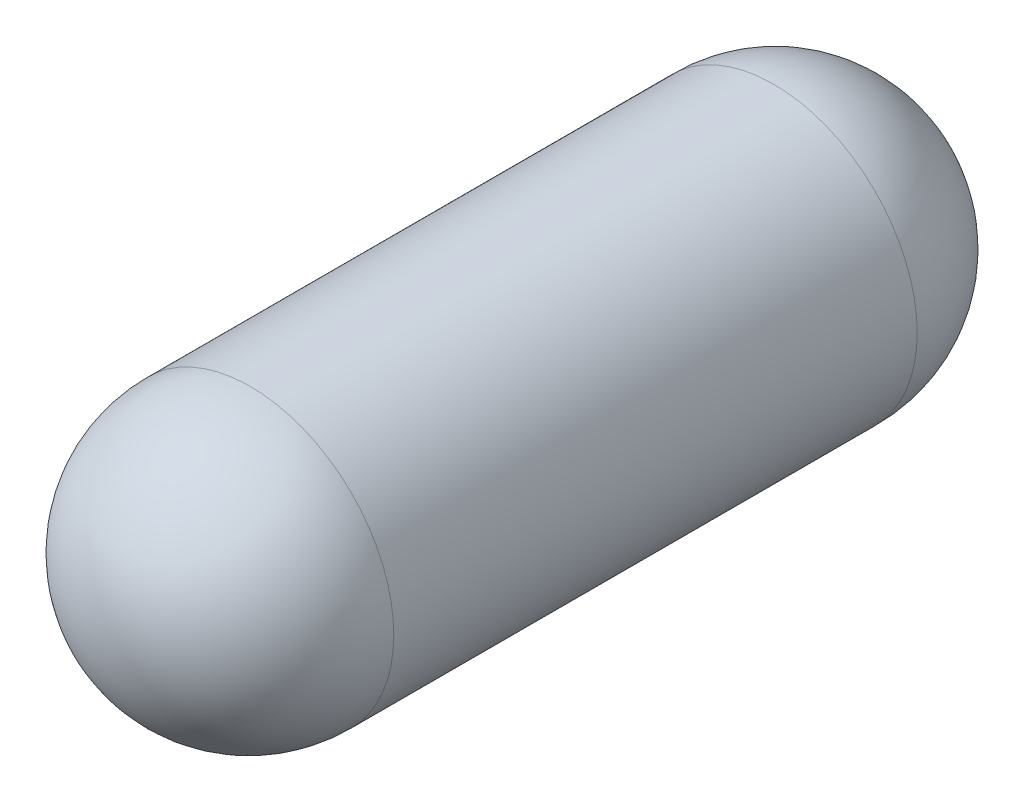
ISO-10303-21;
HEADER;
FILE_DESCRIPTION(('STEP AP214'),'2;1');
FILE_NAME('part.step','',(''),(''),'','','');
FILE_SCHEMA(('AUTOMOTIVE_DESIGN { 1 0 10303 214 1 1 1 1 }'));
ENDSEC;
DATA;
#1=APPLICATION_CONTEXT('core data for automotive mechanical design processes');
#2=APPLICATION_PROTOCOL_DEFINITION('international standard','automotive_design',2000,#1);
#3=PRODUCT_CONTEXT('',#1,'mechanical');
#4=PRODUCT('Part','Part','',(#3));
#5=PRODUCT_RELATED_PRODUCT_CATEGORY('part','',(#4));
#6=PRODUCT_DEFINITION_FORMATION('','',#4);
#7=PRODUCT_DEFINITION_CONTEXT('part definition',#1,'design');
#8=PRODUCT_DEFINITION('design','',#6,#7);
#9=PRODUCT_DEFINITION_SHAPE('','',#8);
#10=(LENGTH_UNIT() NAMED_UNIT(*) SI_UNIT(.MILLI.,.METRE.));
#11=(NAMED_UNIT(*) PLANE_ANGLE_UNIT() SI_UNIT($,.RADIAN.));
#12=(NAMED_UNIT(*) SI_UNIT($,.STERADIAN.) SOLID_ANGLE_UNIT());
#13=UNCERTAINTY_MEASURE_WITH_UNIT(LENGTH_MEASURE(1.E-05),#10,'distance_accuracy_value','');
#14=(GEOMETRIC_REPRESENTATION_CONTEXT(3) GLOBAL_UNCERTAINTY_ASSIGNED_CONTEXT((#13)) GLOBAL_UNIT_ASSIGNED_CONTEXT((#10,
#11,#12)) REPRESENTATION_CONTEXT('',''));
#15=CARTESIAN_POINT('',(0.,0.,0.));
#16=DIRECTION('',(0.,0.,1.));
#17=DIRECTION('',(1.,0.,0.));
#18=AXIS2_PLACEMENT_3D('',#15,#16,#17);
#19=CARTESIAN_POINT('',(0.,0.,177.8));
#20=DIRECTION('',(0.,0.,-1.));
#21=DIRECTION('',(-1.,0.,0.));
#22=AXIS2_PLACEMENT_3D('',#19,#20,#21);
#23=CYLINDRICAL_SURFACE('',#22,48.73625);
#24=CARTESIAN_POINT('',(0.,0.,177.8));
#25=DIRECTION('',(0.,0.,1.));
#26=DIRECTION('',(1.,0.,0.));
#27=AXIS2_PLACEMENT_3D('',#24,#25,#26);
#28=CIRCLE('',#27,48.73625);
#29=CARTESIAN_POINT('',(48.73625,0.,177.8));
#30=VERTEX_POINT('',#29);
#31=EDGE_CURVE('E10',#30,#30,#28,.T.);
#32=ORIENTED_EDGE('',*,*,#31,.F.);
#33=EDGE_LOOP('',(#32));
#34=FACE_BOUND('',#33,.T.);
#35=CARTESIAN_POINT('',(0.,0.,0.));
#36=DIRECTION('',(0.,0.,1.));
#37=DIRECTION('',(1.,0.,0.));
#38=AXIS2_PLACEMENT_3D('',#35,#36,#37);
#39=CIRCLE('',#38,48.73625);
#40=CARTESIAN_POINT('',(48.73625,0.,0.));
#41=VERTEX_POINT('',#40);
#42=EDGE_CURVE('E35',#41,#41,#39,.T.);
#43=ORIENTED_EDGE('',*,*,#42,.T.);
#44=EDGE_LOOP('',(#43));
#45=FACE_BOUND('',#44,.T.);
#46=ADVANCED_FACE('F31',(#34,#45),#23,.T.);
#47=CARTESIAN_POINT('',(0.,0.,178.273945564516));
#48=DIRECTION('',(0.,0.,1.));
#49=DIRECTION('',(1.,0.,0.));
#50=AXIS2_PLACEMENT_3D('',#47,#48,#49);
#51=SPHERICAL_SURFACE('',#50,48.7385544354839);
#52=ORIENTED_EDGE('',*,*,#31,.T.);
#53=EDGE_LOOP('',(#52));
#54=FACE_BOUND('',#53,.T.);
#55=ADVANCED_FACE('F46',(#54),#51,.T.);
#56=CARTESIAN_POINT('',(0.,0.,-0.473945564516132));
#57=DIRECTION('',(0.,0.,1.));
#58=DIRECTION('',(1.,0.,0.));
#59=AXIS2_PLACEMENT_3D('',#56,#57,#58);
#60=SPHERICAL_SURFACE('',#59,48.7385544354839);
#61=ORIENTED_EDGE('',*,*,#42,.F.);
#62=EDGE_LOOP('',(#61));
#63=FACE_BOUND('',#62,.T.);
#64=ADVANCED_FACE('F33',(#63),#60,.T.);
#65=CLOSED_SHELL('',(#46,#55,#64));
#66=MANIFOLD_SOLID_BREP('B2',#65);
#67=ADVANCED_BREP_SHAPE_REPRESENTATION('',(#18,#66),#14);
#68=SHAPE_DEFINITION_REPRESENTATION(#9,#67);
ENDSEC;
END-ISO-10303-21;
